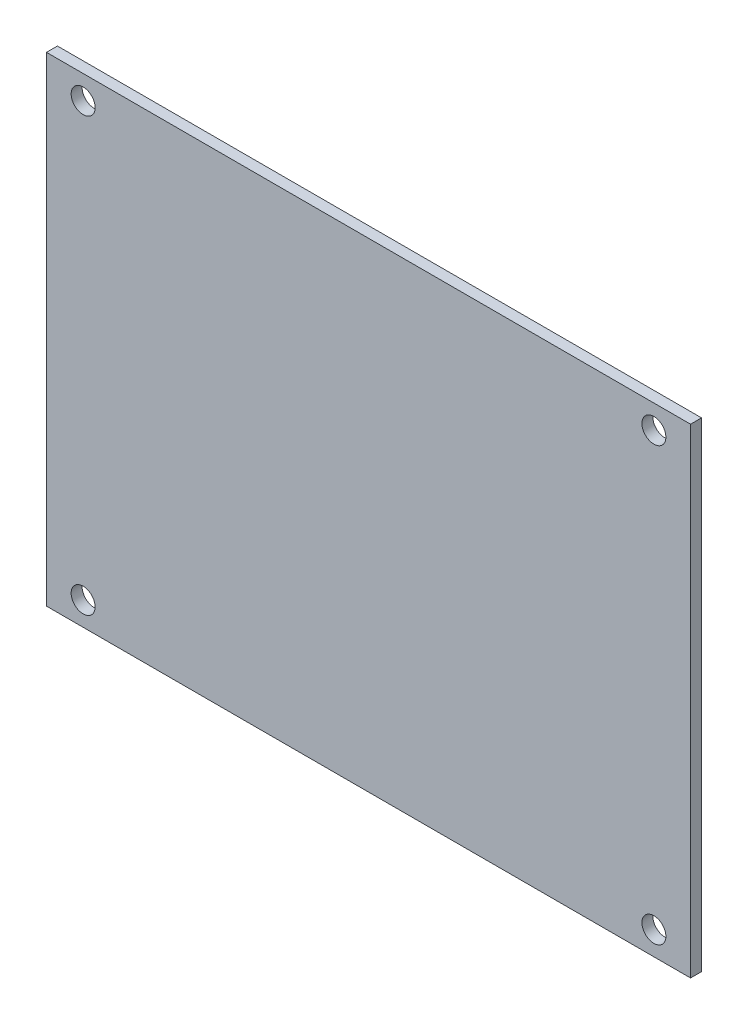
ISO-10303-21;
HEADER;
FILE_DESCRIPTION(('STEP AP214'),'2;1');
FILE_NAME('part.step','',(''),(''),'','','');
FILE_SCHEMA(('AUTOMOTIVE_DESIGN { 1 0 10303 214 1 1 1 1 }'));
ENDSEC;
DATA;
#1=APPLICATION_CONTEXT('core data for automotive mechanical design processes');
#2=APPLICATION_PROTOCOL_DEFINITION('international standard','automotive_design',2000,#1);
#3=PRODUCT_CONTEXT('',#1,'mechanical');
#4=PRODUCT('Part','Part','',(#3));
#5=PRODUCT_RELATED_PRODUCT_CATEGORY('part','',(#4));
#6=PRODUCT_DEFINITION_FORMATION('','',#4);
#7=PRODUCT_DEFINITION_CONTEXT('part definition',#1,'design');
#8=PRODUCT_DEFINITION('design','',#6,#7);
#9=PRODUCT_DEFINITION_SHAPE('','',#8);
#10=(LENGTH_UNIT() NAMED_UNIT(*) SI_UNIT(.MILLI.,.METRE.));
#11=(NAMED_UNIT(*) PLANE_ANGLE_UNIT() SI_UNIT($,.RADIAN.));
#12=(NAMED_UNIT(*) SI_UNIT($,.STERADIAN.) SOLID_ANGLE_UNIT());
#13=UNCERTAINTY_MEASURE_WITH_UNIT(LENGTH_MEASURE(1.E-05),#10,'distance_accuracy_value','');
#14=(GEOMETRIC_REPRESENTATION_CONTEXT(3) GLOBAL_UNCERTAINTY_ASSIGNED_CONTEXT((#13)) GLOBAL_UNIT_ASSIGNED_CONTEXT((#10,
#11,#12)) REPRESENTATION_CONTEXT('',''));
#15=CARTESIAN_POINT('',(0.,0.,0.));
#16=DIRECTION('',(0.,0.,1.));
#17=DIRECTION('',(1.,0.,0.));
#18=AXIS2_PLACEMENT_3D('',#15,#16,#17);
#19=CARTESIAN_POINT('',(0.,0.,1.6));
#20=DIRECTION('',(0.,0.,-1.));
#21=DIRECTION('',(-1.,0.,0.));
#22=AXIS2_PLACEMENT_3D('',#19,#20,#21);
#23=PLANE('',#22);
#24=DIRECTION('',(0.,1.,0.));
#25=VECTOR('',#24,1.);
#26=CARTESIAN_POINT('',(47.,-35.,1.6));
#27=LINE('',#26,#25);
#28=CARTESIAN_POINT('',(47.,-35.,1.6));
#29=VERTEX_POINT('',#28);
#30=CARTESIAN_POINT('',(47.,35.,1.6));
#31=VERTEX_POINT('',#30);
#32=EDGE_CURVE('E88',#29,#31,#27,.T.);
#33=ORIENTED_EDGE('',*,*,#32,.T.);
#34=DIRECTION('',(-1.,0.,0.));
#35=VECTOR('',#34,1.);
#36=CARTESIAN_POINT('',(-47.,35.,1.6));
#37=LINE('',#36,#35);
#38=CARTESIAN_POINT('',(-47.,35.,1.6));
#39=VERTEX_POINT('',#38);
#40=EDGE_CURVE('E83',#31,#39,#37,.T.);
#41=ORIENTED_EDGE('',*,*,#40,.T.);
#42=DIRECTION('',(0.,-1.,0.));
#43=VECTOR('',#42,1.);
#44=CARTESIAN_POINT('',(-47.,-35.,1.6));
#45=LINE('',#44,#43);
#46=CARTESIAN_POINT('',(-47.,-35.,1.6));
#47=VERTEX_POINT('',#46);
#48=EDGE_CURVE('E86',#39,#47,#45,.T.);
#49=ORIENTED_EDGE('',*,*,#48,.T.);
#50=DIRECTION('',(1.,0.,0.));
#51=VECTOR('',#50,1.);
#52=CARTESIAN_POINT('',(-47.,-35.,1.6));
#53=LINE('',#52,#51);
#54=EDGE_CURVE('E53',#47,#29,#53,.T.);
#55=ORIENTED_EDGE('',*,*,#54,.T.);
#56=EDGE_LOOP('',(#33,#41,#49,#55));
#57=FACE_BOUND('',#56,.T.);
#58=CARTESIAN_POINT('',(-41.65,31.55,1.6));
#59=DIRECTION('',(0.,0.,1.));
#60=DIRECTION('',(1.,0.,0.));
#61=AXIS2_PLACEMENT_3D('',#58,#59,#60);
#62=CIRCLE('',#61,1.75);
#63=CARTESIAN_POINT('',(-39.9,31.55,1.6));
#64=VERTEX_POINT('',#63);
#65=EDGE_CURVE('E114',#64,#64,#62,.T.);
#66=ORIENTED_EDGE('',*,*,#65,.F.);
#67=EDGE_LOOP('',(#66));
#68=FACE_BOUND('',#67,.T.);
#69=CARTESIAN_POINT('',(41.65,31.55,1.6));
#70=DIRECTION('',(0.,0.,1.));
#71=DIRECTION('',(-1.,0.,0.));
#72=AXIS2_PLACEMENT_3D('',#69,#70,#71);
#73=CIRCLE('',#72,1.75);
#74=CARTESIAN_POINT('',(39.9,31.55,1.6));
#75=VERTEX_POINT('',#74);
#76=EDGE_CURVE('E124',#75,#75,#73,.T.);
#77=ORIENTED_EDGE('',*,*,#76,.F.);
#78=EDGE_LOOP('',(#77));
#79=FACE_BOUND('',#78,.T.);
#80=CARTESIAN_POINT('',(41.65,-31.55,1.6));
#81=DIRECTION('',(0.,0.,1.));
#82=DIRECTION('',(1.,0.,0.));
#83=AXIS2_PLACEMENT_3D('',#80,#81,#82);
#84=CIRCLE('',#83,1.75);
#85=CARTESIAN_POINT('',(43.4,-31.55,1.6));
#86=VERTEX_POINT('',#85);
#87=EDGE_CURVE('E239',#86,#86,#84,.T.);
#88=ORIENTED_EDGE('',*,*,#87,.F.);
#89=EDGE_LOOP('',(#88));
#90=FACE_BOUND('',#89,.T.);
#91=CARTESIAN_POINT('',(-41.65,-31.55,1.6));
#92=DIRECTION('',(0.,0.,1.));
#93=DIRECTION('',(-1.,0.,0.));
#94=AXIS2_PLACEMENT_3D('',#91,#92,#93);
#95=CIRCLE('',#94,1.75);
#96=CARTESIAN_POINT('',(-43.4,-31.55,1.6));
#97=VERTEX_POINT('',#96);
#98=EDGE_CURVE('E229',#97,#97,#95,.T.);
#99=ORIENTED_EDGE('',*,*,#98,.F.);
#100=EDGE_LOOP('',(#99));
#101=FACE_BOUND('',#100,.T.);
#102=ADVANCED_FACE('F36',(#57,#68,#79,#90,#101),#23,.F.);
#103=CARTESIAN_POINT('',(0.,0.,0.));
#104=DIRECTION('',(0.,0.,-1.));
#105=DIRECTION('',(-1.,0.,0.));
#106=AXIS2_PLACEMENT_3D('',#103,#104,#105);
#107=PLANE('',#106);
#108=CARTESIAN_POINT('',(41.65,-31.55,0.));
#109=DIRECTION('',(0.,0.,1.));
#110=DIRECTION('',(1.,0.,0.));
#111=AXIS2_PLACEMENT_3D('',#108,#109,#110);
#112=CIRCLE('',#111,1.75);
#113=CARTESIAN_POINT('',(43.4,-31.55,0.));
#114=VERTEX_POINT('',#113);
#115=EDGE_CURVE('E236',#114,#114,#112,.T.);
#116=ORIENTED_EDGE('',*,*,#115,.T.);
#117=EDGE_LOOP('',(#116));
#118=FACE_BOUND('',#117,.T.);
#119=CARTESIAN_POINT('',(-41.65,31.55,0.));
#120=DIRECTION('',(0.,0.,1.));
#121=DIRECTION('',(1.,0.,0.));
#122=AXIS2_PLACEMENT_3D('',#119,#120,#121);
#123=CIRCLE('',#122,1.75);
#124=CARTESIAN_POINT('',(-39.9,31.55,0.));
#125=VERTEX_POINT('',#124);
#126=EDGE_CURVE('E121',#125,#125,#123,.T.);
#127=ORIENTED_EDGE('',*,*,#126,.T.);
#128=EDGE_LOOP('',(#127));
#129=FACE_BOUND('',#128,.T.);
#130=DIRECTION('',(0.,1.,0.));
#131=VECTOR('',#130,1.);
#132=CARTESIAN_POINT('',(47.,-35.,0.));
#133=LINE('',#132,#131);
#134=CARTESIAN_POINT('',(47.,-35.,0.));
#135=VERTEX_POINT('',#134);
#136=CARTESIAN_POINT('',(47.,35.,0.));
#137=VERTEX_POINT('',#136);
#138=EDGE_CURVE('E120',#135,#137,#133,.T.);
#139=ORIENTED_EDGE('',*,*,#138,.F.);
#140=DIRECTION('',(1.,0.,0.));
#141=VECTOR('',#140,1.);
#142=CARTESIAN_POINT('',(-47.,-35.,0.));
#143=LINE('',#142,#141);
#144=CARTESIAN_POINT('',(-47.,-35.,0.));
#145=VERTEX_POINT('',#144);
#146=EDGE_CURVE('E76',#145,#135,#143,.T.);
#147=ORIENTED_EDGE('',*,*,#146,.F.);
#148=DIRECTION('',(0.,-1.,0.));
#149=VECTOR('',#148,1.);
#150=CARTESIAN_POINT('',(-47.,-35.,0.));
#151=LINE('',#150,#149);
#152=CARTESIAN_POINT('',(-47.,35.,0.));
#153=VERTEX_POINT('',#152);
#154=EDGE_CURVE('E70',#153,#145,#151,.T.);
#155=ORIENTED_EDGE('',*,*,#154,.F.);
#156=DIRECTION('',(-1.,0.,0.));
#157=VECTOR('',#156,1.);
#158=CARTESIAN_POINT('',(-47.,35.,0.));
#159=LINE('',#158,#157);
#160=EDGE_CURVE('E93',#137,#153,#159,.T.);
#161=ORIENTED_EDGE('',*,*,#160,.F.);
#162=EDGE_LOOP('',(#139,#147,#155,#161));
#163=FACE_BOUND('',#162,.T.);
#164=CARTESIAN_POINT('',(41.65,31.55,0.));
#165=DIRECTION('',(0.,0.,1.));
#166=DIRECTION('',(-1.,0.,0.));
#167=AXIS2_PLACEMENT_3D('',#164,#165,#166);
#168=CIRCLE('',#167,1.75);
#169=CARTESIAN_POINT('',(39.9,31.55,0.));
#170=VERTEX_POINT('',#169);
#171=EDGE_CURVE('E122',#170,#170,#168,.T.);
#172=ORIENTED_EDGE('',*,*,#171,.T.);
#173=EDGE_LOOP('',(#172));
#174=FACE_BOUND('',#173,.T.);
#175=CARTESIAN_POINT('',(-41.65,-31.55,0.));
#176=DIRECTION('',(0.,0.,1.));
#177=DIRECTION('',(-1.,0.,0.));
#178=AXIS2_PLACEMENT_3D('',#175,#176,#177);
#179=CIRCLE('',#178,1.75);
#180=CARTESIAN_POINT('',(-43.4,-31.55,0.));
#181=VERTEX_POINT('',#180);
#182=EDGE_CURVE('E232',#181,#181,#179,.T.);
#183=ORIENTED_EDGE('',*,*,#182,.T.);
#184=EDGE_LOOP('',(#183));
#185=FACE_BOUND('',#184,.T.);
#186=ADVANCED_FACE('F135',(#118,#129,#163,#174,#185),#107,.T.);
#187=CARTESIAN_POINT('',(47.,-35.,1.6));
#188=DIRECTION('',(-1.,0.,0.));
#189=DIRECTION('',(0.,0.,1.));
#190=AXIS2_PLACEMENT_3D('',#187,#188,#189);
#191=PLANE('',#190);
#192=ORIENTED_EDGE('',*,*,#138,.T.);
#193=DIRECTION('',(0.,0.,-1.));
#194=VECTOR('',#193,1.);
#195=CARTESIAN_POINT('',(47.,35.,1.6));
#196=LINE('',#195,#194);
#197=EDGE_CURVE('E12',#31,#137,#196,.T.);
#198=ORIENTED_EDGE('',*,*,#197,.F.);
#199=ORIENTED_EDGE('',*,*,#32,.F.);
#200=DIRECTION('',(0.,0.,-1.));
#201=VECTOR('',#200,1.);
#202=CARTESIAN_POINT('',(47.,-35.,1.6));
#203=LINE('',#202,#201);
#204=EDGE_CURVE('E99',#29,#135,#203,.T.);
#205=ORIENTED_EDGE('',*,*,#204,.T.);
#206=EDGE_LOOP('',(#192,#198,#199,#205));
#207=FACE_BOUND('',#206,.T.);
#208=ADVANCED_FACE('F38',(#207),#191,.F.);
#209=CARTESIAN_POINT('',(-47.,35.,1.6));
#210=DIRECTION('',(0.,-1.,0.));
#211=DIRECTION('',(0.,0.,-1.));
#212=AXIS2_PLACEMENT_3D('',#209,#210,#211);
#213=PLANE('',#212);
#214=ORIENTED_EDGE('',*,*,#160,.T.);
#215=DIRECTION('',(0.,0.,-1.));
#216=VECTOR('',#215,1.);
#217=CARTESIAN_POINT('',(-47.,35.,1.6));
#218=LINE('',#217,#216);
#219=EDGE_CURVE('E45',#39,#153,#218,.T.);
#220=ORIENTED_EDGE('',*,*,#219,.F.);
#221=ORIENTED_EDGE('',*,*,#40,.F.);
#222=ORIENTED_EDGE('',*,*,#197,.T.);
#223=EDGE_LOOP('',(#214,#220,#221,#222));
#224=FACE_BOUND('',#223,.T.);
#225=ADVANCED_FACE('F92',(#224),#213,.F.);
#226=CARTESIAN_POINT('',(-47.,-35.,1.6));
#227=DIRECTION('',(1.,0.,0.));
#228=DIRECTION('',(0.,0.,-1.));
#229=AXIS2_PLACEMENT_3D('',#226,#227,#228);
#230=PLANE('',#229);
#231=ORIENTED_EDGE('',*,*,#154,.T.);
#232=DIRECTION('',(0.,0.,-1.));
#233=VECTOR('',#232,1.);
#234=CARTESIAN_POINT('',(-47.,-35.,1.6));
#235=LINE('',#234,#233);
#236=EDGE_CURVE('E94',#47,#145,#235,.T.);
#237=ORIENTED_EDGE('',*,*,#236,.F.);
#238=ORIENTED_EDGE('',*,*,#48,.F.);
#239=ORIENTED_EDGE('',*,*,#219,.T.);
#240=EDGE_LOOP('',(#231,#237,#238,#239));
#241=FACE_BOUND('',#240,.T.);
#242=ADVANCED_FACE('F95',(#241),#230,.F.);
#243=CARTESIAN_POINT('',(-47.,-35.,1.6));
#244=DIRECTION('',(0.,1.,0.));
#245=DIRECTION('',(0.,0.,1.));
#246=AXIS2_PLACEMENT_3D('',#243,#244,#245);
#247=PLANE('',#246);
#248=ORIENTED_EDGE('',*,*,#146,.T.);
#249=ORIENTED_EDGE('',*,*,#204,.F.);
#250=ORIENTED_EDGE('',*,*,#54,.F.);
#251=ORIENTED_EDGE('',*,*,#236,.T.);
#252=EDGE_LOOP('',(#248,#249,#250,#251));
#253=FACE_BOUND('',#252,.T.);
#254=ADVANCED_FACE('F132',(#253),#247,.F.);
#255=CARTESIAN_POINT('',(-41.65,31.55,1.6));
#256=DIRECTION('',(0.,0.,-1.));
#257=DIRECTION('',(-1.,0.,0.));
#258=AXIS2_PLACEMENT_3D('',#255,#256,#257);
#259=CYLINDRICAL_SURFACE('',#258,1.75);
#260=ORIENTED_EDGE('',*,*,#65,.T.);
#261=EDGE_LOOP('',(#260));
#262=FACE_BOUND('',#261,.T.);
#263=ORIENTED_EDGE('',*,*,#126,.F.);
#264=EDGE_LOOP('',(#263));
#265=FACE_BOUND('',#264,.T.);
#266=ADVANCED_FACE('F151',(#262,#265),#259,.F.);
#267=CARTESIAN_POINT('',(41.65,31.55,1.6));
#268=DIRECTION('',(0.,0.,-1.));
#269=DIRECTION('',(-1.,0.,0.));
#270=AXIS2_PLACEMENT_3D('',#267,#268,#269);
#271=CYLINDRICAL_SURFACE('',#270,1.75);
#272=ORIENTED_EDGE('',*,*,#76,.T.);
#273=EDGE_LOOP('',(#272));
#274=FACE_BOUND('',#273,.T.);
#275=ORIENTED_EDGE('',*,*,#171,.F.);
#276=EDGE_LOOP('',(#275));
#277=FACE_BOUND('',#276,.T.);
#278=ADVANCED_FACE('F171',(#274,#277),#271,.F.);
#279=CARTESIAN_POINT('',(41.65,-31.55,1.6));
#280=DIRECTION('',(0.,0.,-1.));
#281=DIRECTION('',(-1.,0.,0.));
#282=AXIS2_PLACEMENT_3D('',#279,#280,#281);
#283=CYLINDRICAL_SURFACE('',#282,1.75);
#284=ORIENTED_EDGE('',*,*,#87,.T.);
#285=EDGE_LOOP('',(#284));
#286=FACE_BOUND('',#285,.T.);
#287=ORIENTED_EDGE('',*,*,#115,.F.);
#288=EDGE_LOOP('',(#287));
#289=FACE_BOUND('',#288,.T.);
#290=ADVANCED_FACE('F178',(#286,#289),#283,.F.);
#291=CARTESIAN_POINT('',(-41.65,-31.55,1.6));
#292=DIRECTION('',(0.,0.,-1.));
#293=DIRECTION('',(-1.,0.,0.));
#294=AXIS2_PLACEMENT_3D('',#291,#292,#293);
#295=CYLINDRICAL_SURFACE('',#294,1.75);
#296=ORIENTED_EDGE('',*,*,#98,.T.);
#297=EDGE_LOOP('',(#296));
#298=FACE_BOUND('',#297,.T.);
#299=ORIENTED_EDGE('',*,*,#182,.F.);
#300=EDGE_LOOP('',(#299));
#301=FACE_BOUND('',#300,.T.);
#302=ADVANCED_FACE('F185',(#298,#301),#295,.F.);
#303=CLOSED_SHELL('',(#102,#186,#208,#225,#242,#254,#266,#278,#290,#302));
#304=MANIFOLD_SOLID_BREP('B2',#303);
#305=ADVANCED_BREP_SHAPE_REPRESENTATION('',(#18,#304),#14);
#306=SHAPE_DEFINITION_REPRESENTATION(#9,#305);
ENDSEC;
END-ISO-10303-21;
